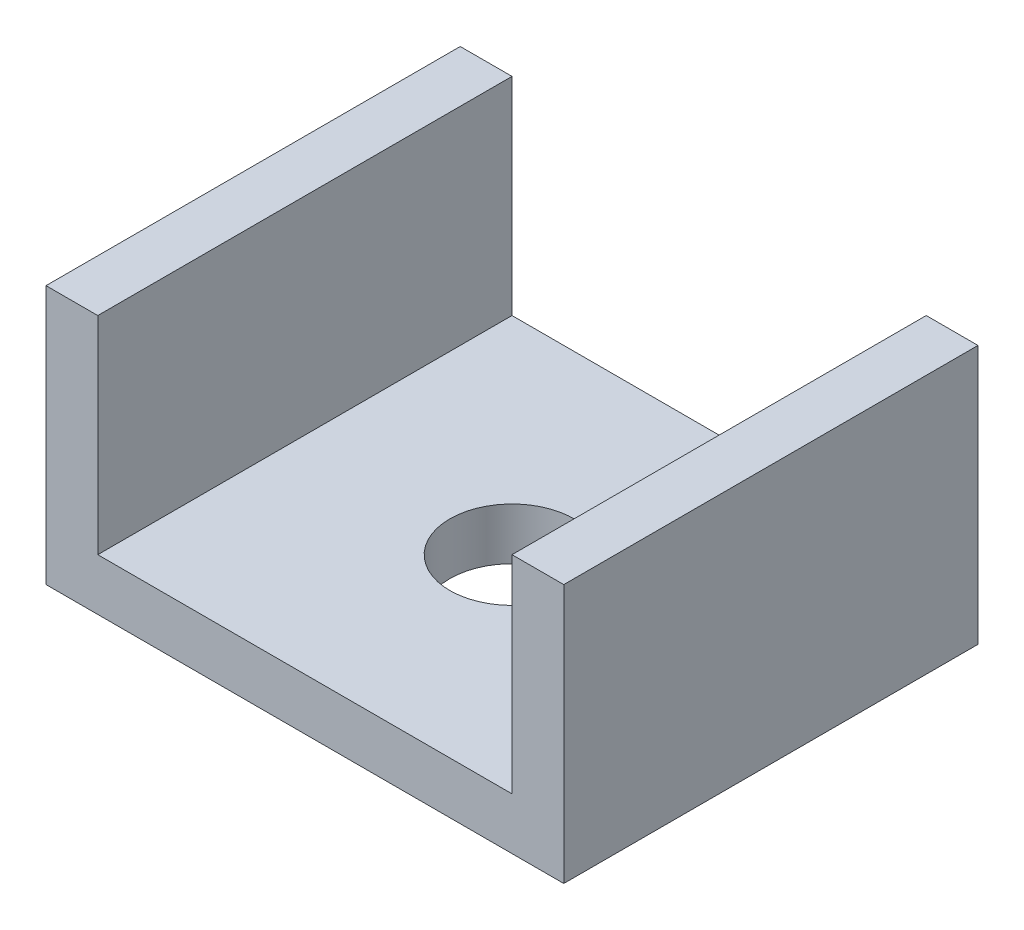
ISO-10303-21;
HEADER;
FILE_DESCRIPTION(('STEP AP214'),'2;1');
FILE_NAME('part.step','',(''),(''),'','','');
FILE_SCHEMA(('AUTOMOTIVE_DESIGN { 1 0 10303 214 1 1 1 1 }'));
ENDSEC;
DATA;
#1=APPLICATION_CONTEXT('core data for automotive mechanical design processes');
#2=APPLICATION_PROTOCOL_DEFINITION('international standard','automotive_design',2000,#1);
#3=PRODUCT_CONTEXT('',#1,'mechanical');
#4=PRODUCT('Part','Part','',(#3));
#5=PRODUCT_RELATED_PRODUCT_CATEGORY('part','',(#4));
#6=PRODUCT_DEFINITION_FORMATION('','',#4);
#7=PRODUCT_DEFINITION_CONTEXT('part definition',#1,'design');
#8=PRODUCT_DEFINITION('design','',#6,#7);
#9=PRODUCT_DEFINITION_SHAPE('','',#8);
#10=(LENGTH_UNIT() NAMED_UNIT(*) SI_UNIT(.MILLI.,.METRE.));
#11=(NAMED_UNIT(*) PLANE_ANGLE_UNIT() SI_UNIT($,.RADIAN.));
#12=(NAMED_UNIT(*) SI_UNIT($,.STERADIAN.) SOLID_ANGLE_UNIT());
#13=UNCERTAINTY_MEASURE_WITH_UNIT(LENGTH_MEASURE(1.E-05),#10,'distance_accuracy_value','');
#14=(GEOMETRIC_REPRESENTATION_CONTEXT(3) GLOBAL_UNCERTAINTY_ASSIGNED_CONTEXT((#13)) GLOBAL_UNIT_ASSIGNED_CONTEXT((#10,
#11,#12)) REPRESENTATION_CONTEXT('',''));
#15=CARTESIAN_POINT('',(0.,0.,0.));
#16=DIRECTION('',(0.,0.,1.));
#17=DIRECTION('',(1.,0.,0.));
#18=AXIS2_PLACEMENT_3D('',#15,#16,#17);
#19=CARTESIAN_POINT('',(-15.875,0.,25.4));
#20=DIRECTION('',(1.,0.,0.));
#21=DIRECTION('',(0.,0.,-1.));
#22=AXIS2_PLACEMENT_3D('',#19,#20,#21);
#23=PLANE('',#22);
#24=DIRECTION('',(0.,-1.,0.));
#25=VECTOR('',#24,1.);
#26=CARTESIAN_POINT('',(-15.875,0.,0.));
#27=LINE('',#26,#25);
#28=CARTESIAN_POINT('',(-15.875,15.875,0.));
#29=VERTEX_POINT('',#28);
#30=CARTESIAN_POINT('',(-15.875,0.,0.));
#31=VERTEX_POINT('',#30);
#32=EDGE_CURVE('E129',#29,#31,#27,.T.);
#33=ORIENTED_EDGE('',*,*,#32,.T.);
#34=DIRECTION('',(0.,0.,-1.));
#35=VECTOR('',#34,1.);
#36=CARTESIAN_POINT('',(-15.875,0.,25.4));
#37=LINE('',#36,#35);
#38=CARTESIAN_POINT('',(-15.875,0.,25.4));
#39=VERTEX_POINT('',#38);
#40=EDGE_CURVE('E11',#39,#31,#37,.T.);
#41=ORIENTED_EDGE('',*,*,#40,.F.);
#42=DIRECTION('',(0.,-1.,0.));
#43=VECTOR('',#42,1.);
#44=CARTESIAN_POINT('',(-15.875,0.,25.4));
#45=LINE('',#44,#43);
#46=CARTESIAN_POINT('',(-15.875,15.875,25.4));
#47=VERTEX_POINT('',#46);
#48=EDGE_CURVE('E144',#47,#39,#45,.T.);
#49=ORIENTED_EDGE('',*,*,#48,.F.);
#50=DIRECTION('',(0.,0.,-1.));
#51=VECTOR('',#50,1.);
#52=CARTESIAN_POINT('',(-15.875,15.875,25.4));
#53=LINE('',#52,#51);
#54=EDGE_CURVE('E125',#47,#29,#53,.T.);
#55=ORIENTED_EDGE('',*,*,#54,.T.);
#56=EDGE_LOOP('',(#33,#41,#49,#55));
#57=FACE_BOUND('',#56,.T.);
#58=ADVANCED_FACE('F33',(#57),#23,.F.);
#59=CARTESIAN_POINT('',(15.875,0.,25.4));
#60=DIRECTION('',(0.,1.,0.));
#61=DIRECTION('',(-1.,0.,0.));
#62=AXIS2_PLACEMENT_3D('',#59,#60,#61);
#63=PLANE('',#62);
#64=CARTESIAN_POINT('',(0.,0.,12.7));
#65=DIRECTION('',(0.,1.,0.));
#66=DIRECTION('',(-1.,0.,0.));
#67=AXIS2_PLACEMENT_3D('',#64,#65,#66);
#68=CIRCLE('',#67,3.81);
#69=CARTESIAN_POINT('',(-3.80999999999999,0.,12.7));
#70=VERTEX_POINT('',#69);
#71=EDGE_CURVE('E133',#70,#70,#68,.T.);
#72=ORIENTED_EDGE('',*,*,#71,.T.);
#73=EDGE_LOOP('',(#72));
#74=FACE_BOUND('',#73,.T.);
#75=DIRECTION('',(1.,0.,0.));
#76=VECTOR('',#75,1.);
#77=CARTESIAN_POINT('',(15.875,0.,0.));
#78=LINE('',#77,#76);
#79=CARTESIAN_POINT('',(15.875,0.,0.));
#80=VERTEX_POINT('',#79);
#81=EDGE_CURVE('E132',#31,#80,#78,.T.);
#82=ORIENTED_EDGE('',*,*,#81,.T.);
#83=DIRECTION('',(0.,0.,-1.));
#84=VECTOR('',#83,1.);
#85=CARTESIAN_POINT('',(15.875,0.,25.4));
#86=LINE('',#85,#84);
#87=CARTESIAN_POINT('',(15.875,0.,25.4));
#88=VERTEX_POINT('',#87);
#89=EDGE_CURVE('E41',#88,#80,#86,.T.);
#90=ORIENTED_EDGE('',*,*,#89,.F.);
#91=DIRECTION('',(1.,0.,0.));
#92=VECTOR('',#91,1.);
#93=CARTESIAN_POINT('',(15.875,0.,25.4));
#94=LINE('',#93,#92);
#95=EDGE_CURVE('E92',#39,#88,#94,.T.);
#96=ORIENTED_EDGE('',*,*,#95,.F.);
#97=ORIENTED_EDGE('',*,*,#40,.T.);
#98=EDGE_LOOP('',(#82,#90,#96,#97));
#99=FACE_BOUND('',#98,.T.);
#100=ADVANCED_FACE('F183',(#74,#99),#63,.F.);
#101=CARTESIAN_POINT('',(15.875,0.,25.4));
#102=DIRECTION('',(-1.,0.,0.));
#103=DIRECTION('',(0.,0.,1.));
#104=AXIS2_PLACEMENT_3D('',#101,#102,#103);
#105=PLANE('',#104);
#106=DIRECTION('',(0.,1.,0.));
#107=VECTOR('',#106,1.);
#108=CARTESIAN_POINT('',(15.875,0.,0.));
#109=LINE('',#108,#107);
#110=CARTESIAN_POINT('',(15.875,15.875,0.));
#111=VERTEX_POINT('',#110);
#112=EDGE_CURVE('E135',#80,#111,#109,.T.);
#113=ORIENTED_EDGE('',*,*,#112,.T.);
#114=DIRECTION('',(0.,0.,-1.));
#115=VECTOR('',#114,1.);
#116=CARTESIAN_POINT('',(15.875,15.875,25.4));
#117=LINE('',#116,#115);
#118=CARTESIAN_POINT('',(15.875,15.875,25.4));
#119=VERTEX_POINT('',#118);
#120=EDGE_CURVE('E151',#119,#111,#117,.T.);
#121=ORIENTED_EDGE('',*,*,#120,.F.);
#122=DIRECTION('',(0.,1.,0.));
#123=VECTOR('',#122,1.);
#124=CARTESIAN_POINT('',(15.875,0.,25.4));
#125=LINE('',#124,#123);
#126=EDGE_CURVE('E159',#88,#119,#125,.T.);
#127=ORIENTED_EDGE('',*,*,#126,.F.);
#128=ORIENTED_EDGE('',*,*,#89,.T.);
#129=EDGE_LOOP('',(#113,#121,#127,#128));
#130=FACE_BOUND('',#129,.T.);
#131=ADVANCED_FACE('F157',(#130),#105,.F.);
#132=CARTESIAN_POINT('',(15.875,15.875,25.4));
#133=DIRECTION('',(0.,-1.,0.));
#134=DIRECTION('',(0.,0.,-1.));
#135=AXIS2_PLACEMENT_3D('',#132,#133,#134);
#136=PLANE('',#135);
#137=DIRECTION('',(-1.,0.,0.));
#138=VECTOR('',#137,1.);
#139=CARTESIAN_POINT('',(15.875,15.875,0.));
#140=LINE('',#139,#138);
#141=CARTESIAN_POINT('',(12.7,15.875,0.));
#142=VERTEX_POINT('',#141);
#143=EDGE_CURVE('E137',#111,#142,#140,.T.);
#144=ORIENTED_EDGE('',*,*,#143,.T.);
#145=DIRECTION('',(0.,0.,-1.));
#146=VECTOR('',#145,1.);
#147=CARTESIAN_POINT('',(12.7,15.875,25.4));
#148=LINE('',#147,#146);
#149=CARTESIAN_POINT('',(12.7,15.875,25.4));
#150=VERTEX_POINT('',#149);
#151=EDGE_CURVE('E148',#150,#142,#148,.T.);
#152=ORIENTED_EDGE('',*,*,#151,.F.);
#153=DIRECTION('',(-1.,0.,0.));
#154=VECTOR('',#153,1.);
#155=CARTESIAN_POINT('',(15.875,15.875,25.4));
#156=LINE('',#155,#154);
#157=EDGE_CURVE('E171',#119,#150,#156,.T.);
#158=ORIENTED_EDGE('',*,*,#157,.F.);
#159=ORIENTED_EDGE('',*,*,#120,.T.);
#160=EDGE_LOOP('',(#144,#152,#158,#159));
#161=FACE_BOUND('',#160,.T.);
#162=ADVANCED_FACE('F167',(#161),#136,.F.);
#163=CARTESIAN_POINT('',(12.7,15.875,25.4));
#164=DIRECTION('',(1.,0.,0.));
#165=DIRECTION('',(0.,1.,0.));
#166=AXIS2_PLACEMENT_3D('',#163,#164,#165);
#167=PLANE('',#166);
#168=DIRECTION('',(0.,-1.,0.));
#169=VECTOR('',#168,1.);
#170=CARTESIAN_POINT('',(12.7,15.875,0.));
#171=LINE('',#170,#169);
#172=CARTESIAN_POINT('',(12.7,3.175,0.));
#173=VERTEX_POINT('',#172);
#174=EDGE_CURVE('E139',#142,#173,#171,.T.);
#175=ORIENTED_EDGE('',*,*,#174,.T.);
#176=DIRECTION('',(0.,0.,-1.));
#177=VECTOR('',#176,1.);
#178=CARTESIAN_POINT('',(12.7,3.175,25.4));
#179=LINE('',#178,#177);
#180=CARTESIAN_POINT('',(12.7,3.175,25.4));
#181=VERTEX_POINT('',#180);
#182=EDGE_CURVE('E120',#181,#173,#179,.T.);
#183=ORIENTED_EDGE('',*,*,#182,.F.);
#184=DIRECTION('',(0.,-1.,0.));
#185=VECTOR('',#184,1.);
#186=CARTESIAN_POINT('',(12.7,15.875,25.4));
#187=LINE('',#186,#185);
#188=EDGE_CURVE('E111',#150,#181,#187,.T.);
#189=ORIENTED_EDGE('',*,*,#188,.F.);
#190=ORIENTED_EDGE('',*,*,#151,.T.);
#191=EDGE_LOOP('',(#175,#183,#189,#190));
#192=FACE_BOUND('',#191,.T.);
#193=ADVANCED_FACE('F170',(#192),#167,.F.);
#194=CARTESIAN_POINT('',(-12.7,3.175,25.4));
#195=DIRECTION('',(0.,-1.,0.));
#196=DIRECTION('',(1.,0.,0.));
#197=AXIS2_PLACEMENT_3D('',#194,#195,#196);
#198=PLANE('',#197);
#199=CARTESIAN_POINT('',(0.,3.175,12.7));
#200=DIRECTION('',(0.,1.,0.));
#201=DIRECTION('',(-1.,0.,0.));
#202=AXIS2_PLACEMENT_3D('',#199,#200,#201);
#203=CIRCLE('',#202,3.81);
#204=CARTESIAN_POINT('',(-3.80999999999999,3.175,12.7));
#205=VERTEX_POINT('',#204);
#206=EDGE_CURVE('E177',#205,#205,#203,.T.);
#207=ORIENTED_EDGE('',*,*,#206,.F.);
#208=EDGE_LOOP('',(#207));
#209=FACE_BOUND('',#208,.T.);
#210=DIRECTION('',(-1.,0.,0.));
#211=VECTOR('',#210,1.);
#212=CARTESIAN_POINT('',(-12.7,3.175,0.));
#213=LINE('',#212,#211);
#214=CARTESIAN_POINT('',(-12.7,3.175,0.));
#215=VERTEX_POINT('',#214);
#216=EDGE_CURVE('E119',#173,#215,#213,.T.);
#217=ORIENTED_EDGE('',*,*,#216,.T.);
#218=DIRECTION('',(0.,0.,-1.));
#219=VECTOR('',#218,1.);
#220=CARTESIAN_POINT('',(-12.7,3.175,25.4));
#221=LINE('',#220,#219);
#222=CARTESIAN_POINT('',(-12.7,3.175,25.4));
#223=VERTEX_POINT('',#222);
#224=EDGE_CURVE('E116',#223,#215,#221,.T.);
#225=ORIENTED_EDGE('',*,*,#224,.F.);
#226=DIRECTION('',(-1.,0.,0.));
#227=VECTOR('',#226,1.);
#228=CARTESIAN_POINT('',(-12.7,3.175,25.4));
#229=LINE('',#228,#227);
#230=EDGE_CURVE('E105',#181,#223,#229,.T.);
#231=ORIENTED_EDGE('',*,*,#230,.F.);
#232=ORIENTED_EDGE('',*,*,#182,.T.);
#233=EDGE_LOOP('',(#217,#225,#231,#232));
#234=FACE_BOUND('',#233,.T.);
#235=ADVANCED_FACE('F117',(#209,#234),#198,.F.);
#236=CARTESIAN_POINT('',(-12.7,15.875,25.4));
#237=DIRECTION('',(-1.,0.,0.));
#238=DIRECTION('',(0.,-1.,0.));
#239=AXIS2_PLACEMENT_3D('',#236,#237,#238);
#240=PLANE('',#239);
#241=DIRECTION('',(0.,1.,0.));
#242=VECTOR('',#241,1.);
#243=CARTESIAN_POINT('',(-12.7,15.875,0.));
#244=LINE('',#243,#242);
#245=CARTESIAN_POINT('',(-12.7,15.875,0.));
#246=VERTEX_POINT('',#245);
#247=EDGE_CURVE('E78',#215,#246,#244,.T.);
#248=ORIENTED_EDGE('',*,*,#247,.T.);
#249=DIRECTION('',(0.,0.,-1.));
#250=VECTOR('',#249,1.);
#251=CARTESIAN_POINT('',(-12.7,15.875,25.4));
#252=LINE('',#251,#250);
#253=CARTESIAN_POINT('',(-12.7,15.875,25.4));
#254=VERTEX_POINT('',#253);
#255=EDGE_CURVE('E121',#254,#246,#252,.T.);
#256=ORIENTED_EDGE('',*,*,#255,.F.);
#257=DIRECTION('',(0.,1.,0.));
#258=VECTOR('',#257,1.);
#259=CARTESIAN_POINT('',(-12.7,15.875,25.4));
#260=LINE('',#259,#258);
#261=EDGE_CURVE('E109',#223,#254,#260,.T.);
#262=ORIENTED_EDGE('',*,*,#261,.F.);
#263=ORIENTED_EDGE('',*,*,#224,.T.);
#264=EDGE_LOOP('',(#248,#256,#262,#263));
#265=FACE_BOUND('',#264,.T.);
#266=ADVANCED_FACE('F123',(#265),#240,.F.);
#267=CARTESIAN_POINT('',(-15.875,15.875,25.4));
#268=DIRECTION('',(0.,-1.,0.));
#269=DIRECTION('',(0.,0.,-1.));
#270=AXIS2_PLACEMENT_3D('',#267,#268,#269);
#271=PLANE('',#270);
#272=DIRECTION('',(-1.,0.,0.));
#273=VECTOR('',#272,1.);
#274=CARTESIAN_POINT('',(-15.875,15.875,0.));
#275=LINE('',#274,#273);
#276=EDGE_CURVE('E84',#246,#29,#275,.T.);
#277=ORIENTED_EDGE('',*,*,#276,.T.);
#278=ORIENTED_EDGE('',*,*,#54,.F.);
#279=DIRECTION('',(-1.,0.,0.));
#280=VECTOR('',#279,1.);
#281=CARTESIAN_POINT('',(-15.875,15.875,25.4));
#282=LINE('',#281,#280);
#283=EDGE_CURVE('E49',#254,#47,#282,.T.);
#284=ORIENTED_EDGE('',*,*,#283,.F.);
#285=ORIENTED_EDGE('',*,*,#255,.T.);
#286=EDGE_LOOP('',(#277,#278,#284,#285));
#287=FACE_BOUND('',#286,.T.);
#288=ADVANCED_FACE('F197',(#287),#271,.F.);
#289=CARTESIAN_POINT('',(0.,0.,25.4));
#290=DIRECTION('',(0.,0.,-1.));
#291=DIRECTION('',(-1.,0.,0.));
#292=AXIS2_PLACEMENT_3D('',#289,#290,#291);
#293=PLANE('',#292);
#294=ORIENTED_EDGE('',*,*,#48,.T.);
#295=ORIENTED_EDGE('',*,*,#95,.T.);
#296=ORIENTED_EDGE('',*,*,#126,.T.);
#297=ORIENTED_EDGE('',*,*,#157,.T.);
#298=ORIENTED_EDGE('',*,*,#188,.T.);
#299=ORIENTED_EDGE('',*,*,#230,.T.);
#300=ORIENTED_EDGE('',*,*,#261,.T.);
#301=ORIENTED_EDGE('',*,*,#283,.T.);
#302=EDGE_LOOP('',(#294,#295,#296,#297,#298,#299,#300,#301));
#303=FACE_BOUND('',#302,.T.);
#304=ADVANCED_FACE('F107',(#303),#293,.F.);
#305=CARTESIAN_POINT('',(0.,0.,0.));
#306=DIRECTION('',(0.,0.,-1.));
#307=DIRECTION('',(-1.,0.,0.));
#308=AXIS2_PLACEMENT_3D('',#305,#306,#307);
#309=PLANE('',#308);
#310=ORIENTED_EDGE('',*,*,#32,.F.);
#311=ORIENTED_EDGE('',*,*,#276,.F.);
#312=ORIENTED_EDGE('',*,*,#247,.F.);
#313=ORIENTED_EDGE('',*,*,#216,.F.);
#314=ORIENTED_EDGE('',*,*,#174,.F.);
#315=ORIENTED_EDGE('',*,*,#143,.F.);
#316=ORIENTED_EDGE('',*,*,#112,.F.);
#317=ORIENTED_EDGE('',*,*,#81,.F.);
#318=EDGE_LOOP('',(#310,#311,#312,#313,#314,#315,#316,#317));
#319=FACE_BOUND('',#318,.T.);
#320=ADVANCED_FACE('F163',(#319),#309,.T.);
#321=CARTESIAN_POINT('',(0.,0.,12.7));
#322=DIRECTION('',(0.,1.,0.));
#323=DIRECTION('',(-1.,0.,0.));
#324=AXIS2_PLACEMENT_3D('',#321,#322,#323);
#325=CYLINDRICAL_SURFACE('',#324,3.81);
#326=ORIENTED_EDGE('',*,*,#71,.F.);
#327=EDGE_LOOP('',(#326));
#328=FACE_BOUND('',#327,.T.);
#329=ORIENTED_EDGE('',*,*,#206,.T.);
#330=EDGE_LOOP('',(#329));
#331=FACE_BOUND('',#330,.T.);
#332=ADVANCED_FACE('F185',(#328,#331),#325,.F.);
#333=CLOSED_SHELL('',(#58,#100,#131,#162,#193,#235,#266,#288,#304,#320,#332));
#334=MANIFOLD_SOLID_BREP('B2',#333);
#335=ADVANCED_BREP_SHAPE_REPRESENTATION('',(#18,#334),#14);
#336=SHAPE_DEFINITION_REPRESENTATION(#9,#335);
ENDSEC;
END-ISO-10303-21;
